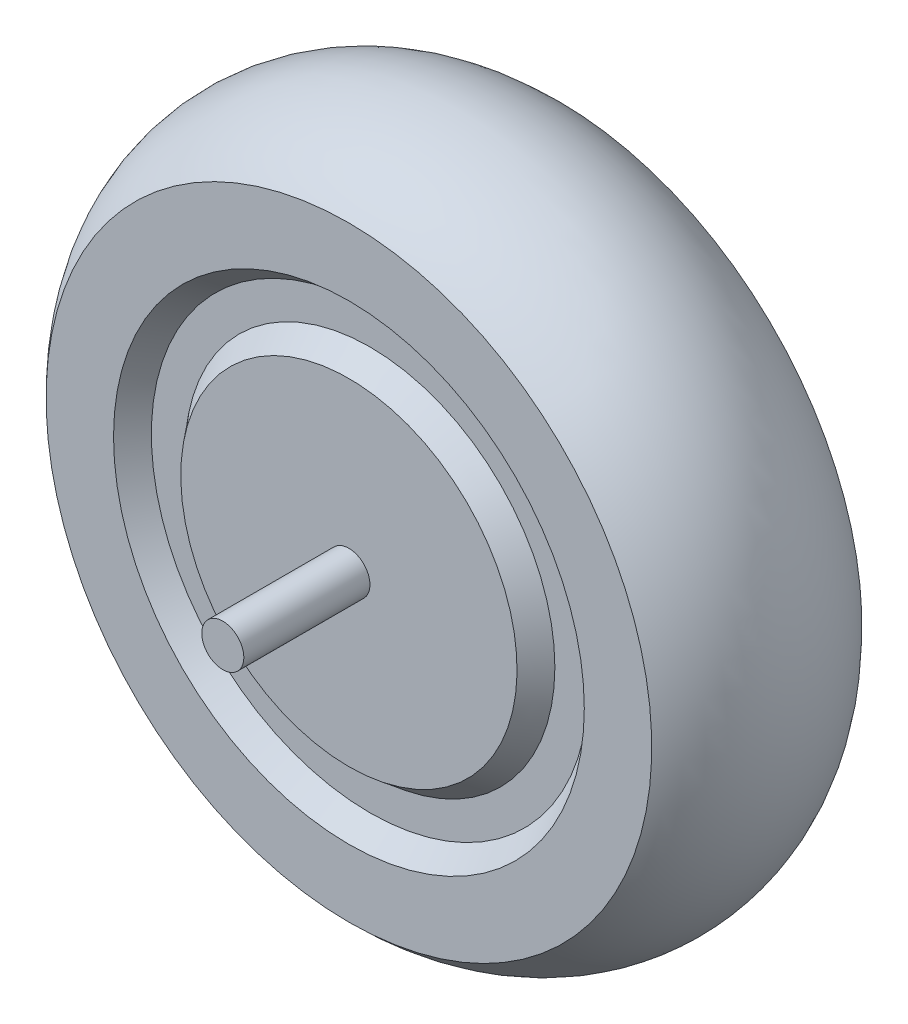
ISO-10303-21;
HEADER;
FILE_DESCRIPTION(('STEP AP214'),'2;1');
FILE_NAME('part.step','',(''),(''),'','','');
FILE_SCHEMA(('AUTOMOTIVE_DESIGN { 1 0 10303 214 1 1 1 1 }'));
ENDSEC;
DATA;
#1=APPLICATION_CONTEXT('core data for automotive mechanical design processes');
#2=APPLICATION_PROTOCOL_DEFINITION('international standard','automotive_design',2000,#1);
#3=PRODUCT_CONTEXT('',#1,'mechanical');
#4=PRODUCT('Part','Part','',(#3));
#5=PRODUCT_RELATED_PRODUCT_CATEGORY('part','',(#4));
#6=PRODUCT_DEFINITION_FORMATION('','',#4);
#7=PRODUCT_DEFINITION_CONTEXT('part definition',#1,'design');
#8=PRODUCT_DEFINITION('design','',#6,#7);
#9=PRODUCT_DEFINITION_SHAPE('','',#8);
#10=(LENGTH_UNIT() NAMED_UNIT(*) SI_UNIT(.MILLI.,.METRE.));
#11=(NAMED_UNIT(*) PLANE_ANGLE_UNIT() SI_UNIT($,.RADIAN.));
#12=(NAMED_UNIT(*) SI_UNIT($,.STERADIAN.) SOLID_ANGLE_UNIT());
#13=UNCERTAINTY_MEASURE_WITH_UNIT(LENGTH_MEASURE(1.E-05),#10,'distance_accuracy_value','');
#14=(GEOMETRIC_REPRESENTATION_CONTEXT(3) GLOBAL_UNCERTAINTY_ASSIGNED_CONTEXT((#13)) GLOBAL_UNIT_ASSIGNED_CONTEXT((#10,
#11,#12)) REPRESENTATION_CONTEXT('',''));
#15=CARTESIAN_POINT('',(0.,0.,0.));
#16=DIRECTION('',(0.,0.,1.));
#17=DIRECTION('',(1.,0.,0.));
#18=AXIS2_PLACEMENT_3D('',#15,#16,#17);
#19=CARTESIAN_POINT('',(0.,0.,40.));
#20=DIRECTION('',(0.,0.,1.));
#21=DIRECTION('',(0.,-1.,0.));
#22=AXIS2_PLACEMENT_3D('',#19,#20,#21);
#23=PLANE('',#22);
#24=CARTESIAN_POINT('',(0.,0.,40.));
#25=DIRECTION('',(0.,0.,1.));
#26=DIRECTION('',(0.,-1.,0.));
#27=AXIS2_PLACEMENT_3D('',#24,#25,#26);
#28=CIRCLE('',#27,5.);
#29=CARTESIAN_POINT('',(0.,-5.,40.));
#30=VERTEX_POINT('',#29);
#31=EDGE_CURVE('E10',#30,#30,#28,.T.);
#32=ORIENTED_EDGE('',*,*,#31,.T.);
#33=EDGE_LOOP('',(#32));
#34=FACE_BOUND('',#33,.T.);
#35=ADVANCED_FACE('F33',(#34),#23,.T.);
#36=CARTESIAN_POINT('',(0.,0.,40.));
#37=DIRECTION('',(0.,0.,1.));
#38=DIRECTION('',(0.,-1.,0.));
#39=AXIS2_PLACEMENT_3D('',#36,#37,#38);
#40=CYLINDRICAL_SURFACE('',#39,5.);
#41=CARTESIAN_POINT('',(0.,0.,10.));
#42=DIRECTION('',(0.,0.,1.));
#43=DIRECTION('',(0.,-1.,0.));
#44=AXIS2_PLACEMENT_3D('',#41,#42,#43);
#45=CIRCLE('',#44,5.00000000000001);
#46=CARTESIAN_POINT('',(0.,-5.,10.));
#47=VERTEX_POINT('',#46);
#48=EDGE_CURVE('E39',#47,#47,#45,.T.);
#49=ORIENTED_EDGE('',*,*,#48,.T.);
#50=EDGE_LOOP('',(#49));
#51=FACE_BOUND('',#50,.T.);
#52=ORIENTED_EDGE('',*,*,#31,.F.);
#53=EDGE_LOOP('',(#52));
#54=FACE_BOUND('',#53,.T.);
#55=ADVANCED_FACE('F89',(#51,#54),#40,.T.);
#56=CARTESIAN_POINT('',(0.,-5.,10.));
#57=DIRECTION('',(0.,0.,1.));
#58=DIRECTION('',(0.,-1.,0.));
#59=AXIS2_PLACEMENT_3D('',#56,#57,#58);
#60=PLANE('',#59);
#61=CARTESIAN_POINT('',(0.,0.,10.));
#62=DIRECTION('',(0.,0.,1.));
#63=DIRECTION('',(0.,-1.,0.));
#64=AXIS2_PLACEMENT_3D('',#61,#62,#63);
#65=CIRCLE('',#64,40.);
#66=CARTESIAN_POINT('',(0.,-40.,10.));
#67=VERTEX_POINT('',#66);
#68=EDGE_CURVE('E43',#67,#67,#65,.T.);
#69=ORIENTED_EDGE('',*,*,#68,.T.);
#70=EDGE_LOOP('',(#69));
#71=FACE_BOUND('',#70,.T.);
#72=ORIENTED_EDGE('',*,*,#48,.F.);
#73=EDGE_LOOP('',(#72));
#74=FACE_BOUND('',#73,.T.);
#75=ADVANCED_FACE('F93',(#71,#74),#60,.T.);
#76=CARTESIAN_POINT('',(0.,0.,10.));
#77=DIRECTION('',(0.,0.,-1.));
#78=DIRECTION('',(0.,1.,0.));
#79=AXIS2_PLACEMENT_3D('',#76,#77,#78);
#80=CONICAL_SURFACE('',#79,40.,0.674740942223553);
#81=CARTESIAN_POINT('',(0.,0.,5.));
#82=DIRECTION('',(0.,0.,1.));
#83=DIRECTION('',(0.,-1.,0.));
#84=AXIS2_PLACEMENT_3D('',#81,#82,#83);
#85=CIRCLE('',#84,44.);
#86=CARTESIAN_POINT('',(0.,-44.,5.));
#87=VERTEX_POINT('',#86);
#88=EDGE_CURVE('E47',#87,#87,#85,.T.);
#89=ORIENTED_EDGE('',*,*,#88,.T.);
#90=EDGE_LOOP('',(#89));
#91=FACE_BOUND('',#90,.T.);
#92=ORIENTED_EDGE('',*,*,#68,.F.);
#93=EDGE_LOOP('',(#92));
#94=FACE_BOUND('',#93,.T.);
#95=ADVANCED_FACE('F97',(#91,#94),#80,.T.);
#96=CARTESIAN_POINT('',(0.,-44.,5.));
#97=DIRECTION('',(0.,0.,1.));
#98=DIRECTION('',(0.,-1.,0.));
#99=AXIS2_PLACEMENT_3D('',#96,#97,#98);
#100=PLANE('',#99);
#101=CARTESIAN_POINT('',(0.,0.,5.));
#102=DIRECTION('',(0.,0.,1.));
#103=DIRECTION('',(0.,-1.,0.));
#104=AXIS2_PLACEMENT_3D('',#101,#102,#103);
#105=CIRCLE('',#104,52.);
#106=CARTESIAN_POINT('',(0.,-52.,4.99999999999999));
#107=VERTEX_POINT('',#106);
#108=EDGE_CURVE('E52',#107,#107,#105,.T.);
#109=ORIENTED_EDGE('',*,*,#108,.T.);
#110=EDGE_LOOP('',(#109));
#111=FACE_BOUND('',#110,.T.);
#112=ORIENTED_EDGE('',*,*,#88,.F.);
#113=EDGE_LOOP('',(#112));
#114=FACE_BOUND('',#113,.T.);
#115=ADVANCED_FACE('F104',(#111,#114),#100,.T.);
#116=CARTESIAN_POINT('',(0.,0.,5.));
#117=DIRECTION('',(0.,0.,1.));
#118=DIRECTION('',(0.,-1.,0.));
#119=AXIS2_PLACEMENT_3D('',#116,#117,#118);
#120=CONICAL_SURFACE('',#119,52.,0.674740942223552);
#121=CARTESIAN_POINT('',(0.,0.,10.));
#122=DIRECTION('',(0.,0.,1.));
#123=DIRECTION('',(0.,-1.,0.));
#124=AXIS2_PLACEMENT_3D('',#121,#122,#123);
#125=CIRCLE('',#124,56.);
#126=CARTESIAN_POINT('',(0.,-56.,9.99999999999999));
#127=VERTEX_POINT('',#126);
#128=EDGE_CURVE('E55',#127,#127,#125,.T.);
#129=ORIENTED_EDGE('',*,*,#128,.T.);
#130=EDGE_LOOP('',(#129));
#131=FACE_BOUND('',#130,.T.);
#132=ORIENTED_EDGE('',*,*,#108,.F.);
#133=EDGE_LOOP('',(#132));
#134=FACE_BOUND('',#133,.T.);
#135=ADVANCED_FACE('F108',(#131,#134),#120,.F.);
#136=CARTESIAN_POINT('',(0.,-56.,10.));
#137=DIRECTION('',(0.,0.,1.));
#138=DIRECTION('',(0.,-1.,0.));
#139=AXIS2_PLACEMENT_3D('',#136,#137,#138);
#140=PLANE('',#139);
#141=CARTESIAN_POINT('',(0.,0.,10.));
#142=DIRECTION('',(0.,0.,1.));
#143=DIRECTION('',(0.,-1.,0.));
#144=AXIS2_PLACEMENT_3D('',#141,#142,#143);
#145=CIRCLE('',#144,72.0448974278318);
#146=CARTESIAN_POINT('',(0.,-72.0448974278318,9.99999999999999));
#147=VERTEX_POINT('',#146);
#148=EDGE_CURVE('E58',#147,#147,#145,.T.);
#149=ORIENTED_EDGE('',*,*,#148,.T.);
#150=EDGE_LOOP('',(#149));
#151=FACE_BOUND('',#150,.T.);
#152=ORIENTED_EDGE('',*,*,#128,.F.);
#153=EDGE_LOOP('',(#152));
#154=FACE_BOUND('',#153,.T.);
#155=ADVANCED_FACE('F112',(#151,#154),#140,.T.);
#156=CARTESIAN_POINT('',(0.,0.,-15.));
#157=DIRECTION('',(0.,0.,1.));
#158=DIRECTION('',(0.,-1.,0.));
#159=AXIS2_PLACEMENT_3D('',#156,#157,#158);
#160=TOROIDAL_SURFACE('',#159,47.55,35.);
#161=CARTESIAN_POINT('',(0.,0.,-40.));
#162=DIRECTION('',(0.,0.,1.));
#163=DIRECTION('',(0.,-1.,0.));
#164=AXIS2_PLACEMENT_3D('',#161,#162,#163);
#165=CIRCLE('',#164,72.0448974278318);
#166=CARTESIAN_POINT('',(0.,-72.0448974278318,-40.));
#167=VERTEX_POINT('',#166);
#168=EDGE_CURVE('E61',#167,#167,#165,.T.);
#169=ORIENTED_EDGE('',*,*,#168,.T.);
#170=EDGE_LOOP('',(#169));
#171=FACE_BOUND('',#170,.T.);
#172=ORIENTED_EDGE('',*,*,#148,.F.);
#173=EDGE_LOOP('',(#172));
#174=FACE_BOUND('',#173,.T.);
#175=ADVANCED_FACE('F116',(#171,#174),#160,.T.);
#176=CARTESIAN_POINT('',(0.,-56.,-40.));
#177=DIRECTION('',(0.,0.,-1.));
#178=DIRECTION('',(0.,1.,0.));
#179=AXIS2_PLACEMENT_3D('',#176,#177,#178);
#180=PLANE('',#179);
#181=CARTESIAN_POINT('',(0.,0.,-40.));
#182=DIRECTION('',(0.,0.,1.));
#183=DIRECTION('',(0.,-1.,0.));
#184=AXIS2_PLACEMENT_3D('',#181,#182,#183);
#185=CIRCLE('',#184,56.);
#186=CARTESIAN_POINT('',(0.,-56.,-40.));
#187=VERTEX_POINT('',#186);
#188=EDGE_CURVE('E64',#187,#187,#185,.T.);
#189=ORIENTED_EDGE('',*,*,#188,.T.);
#190=EDGE_LOOP('',(#189));
#191=FACE_BOUND('',#190,.T.);
#192=ORIENTED_EDGE('',*,*,#168,.F.);
#193=EDGE_LOOP('',(#192));
#194=FACE_BOUND('',#193,.T.);
#195=ADVANCED_FACE('F120',(#191,#194),#180,.T.);
#196=CARTESIAN_POINT('',(0.,0.,-40.));
#197=DIRECTION('',(0.,0.,-1.));
#198=DIRECTION('',(0.,1.,0.));
#199=AXIS2_PLACEMENT_3D('',#196,#197,#198);
#200=CONICAL_SURFACE('',#199,56.,0.674740942223552);
#201=CARTESIAN_POINT('',(0.,0.,-35.));
#202=DIRECTION('',(0.,0.,1.));
#203=DIRECTION('',(0.,-1.,0.));
#204=AXIS2_PLACEMENT_3D('',#201,#202,#203);
#205=CIRCLE('',#204,52.);
#206=CARTESIAN_POINT('',(0.,-52.,-35.));
#207=VERTEX_POINT('',#206);
#208=EDGE_CURVE('E67',#207,#207,#205,.T.);
#209=ORIENTED_EDGE('',*,*,#208,.T.);
#210=EDGE_LOOP('',(#209));
#211=FACE_BOUND('',#210,.T.);
#212=ORIENTED_EDGE('',*,*,#188,.F.);
#213=EDGE_LOOP('',(#212));
#214=FACE_BOUND('',#213,.T.);
#215=ADVANCED_FACE('F124',(#211,#214),#200,.F.);
#216=CARTESIAN_POINT('',(0.,-44.,-35.));
#217=DIRECTION('',(0.,0.,-1.));
#218=DIRECTION('',(0.,1.,0.));
#219=AXIS2_PLACEMENT_3D('',#216,#217,#218);
#220=PLANE('',#219);
#221=CARTESIAN_POINT('',(0.,0.,-35.));
#222=DIRECTION('',(0.,0.,1.));
#223=DIRECTION('',(0.,-1.,0.));
#224=AXIS2_PLACEMENT_3D('',#221,#222,#223);
#225=CIRCLE('',#224,44.);
#226=CARTESIAN_POINT('',(0.,-44.,-35.));
#227=VERTEX_POINT('',#226);
#228=EDGE_CURVE('E70',#227,#227,#225,.T.);
#229=ORIENTED_EDGE('',*,*,#228,.T.);
#230=EDGE_LOOP('',(#229));
#231=FACE_BOUND('',#230,.T.);
#232=ORIENTED_EDGE('',*,*,#208,.F.);
#233=EDGE_LOOP('',(#232));
#234=FACE_BOUND('',#233,.T.);
#235=ADVANCED_FACE('F86',(#231,#234),#220,.T.);
#236=CARTESIAN_POINT('',(0.,0.,-35.));
#237=DIRECTION('',(0.,0.,1.));
#238=DIRECTION('',(0.,-1.,0.));
#239=AXIS2_PLACEMENT_3D('',#236,#237,#238);
#240=CONICAL_SURFACE('',#239,44.,0.674740942223554);
#241=CARTESIAN_POINT('',(0.,0.,-40.));
#242=DIRECTION('',(0.,0.,1.));
#243=DIRECTION('',(0.,-1.,0.));
#244=AXIS2_PLACEMENT_3D('',#241,#242,#243);
#245=CIRCLE('',#244,40.);
#246=CARTESIAN_POINT('',(0.,-40.,-40.));
#247=VERTEX_POINT('',#246);
#248=EDGE_CURVE('E73',#247,#247,#245,.T.);
#249=ORIENTED_EDGE('',*,*,#248,.T.);
#250=EDGE_LOOP('',(#249));
#251=FACE_BOUND('',#250,.T.);
#252=ORIENTED_EDGE('',*,*,#228,.F.);
#253=EDGE_LOOP('',(#252));
#254=FACE_BOUND('',#253,.T.);
#255=ADVANCED_FACE('F77',(#251,#254),#240,.T.);
#256=CARTESIAN_POINT('',(0.,0.,-40.));
#257=DIRECTION('',(0.,0.,-1.));
#258=DIRECTION('',(0.,1.,0.));
#259=AXIS2_PLACEMENT_3D('',#256,#257,#258);
#260=PLANE('',#259);
#261=ORIENTED_EDGE('',*,*,#248,.F.);
#262=EDGE_LOOP('',(#261));
#263=FACE_BOUND('',#262,.T.);
#264=ADVANCED_FACE('F80',(#263),#260,.T.);
#265=CLOSED_SHELL('',(#35,#55,#75,#95,#115,#135,#155,#175,#195,#215,#235,#255,#264));
#266=MANIFOLD_SOLID_BREP('B2',#265);
#267=ADVANCED_BREP_SHAPE_REPRESENTATION('',(#18,#266),#14);
#268=SHAPE_DEFINITION_REPRESENTATION(#9,#267);
ENDSEC;
END-ISO-10303-21;
